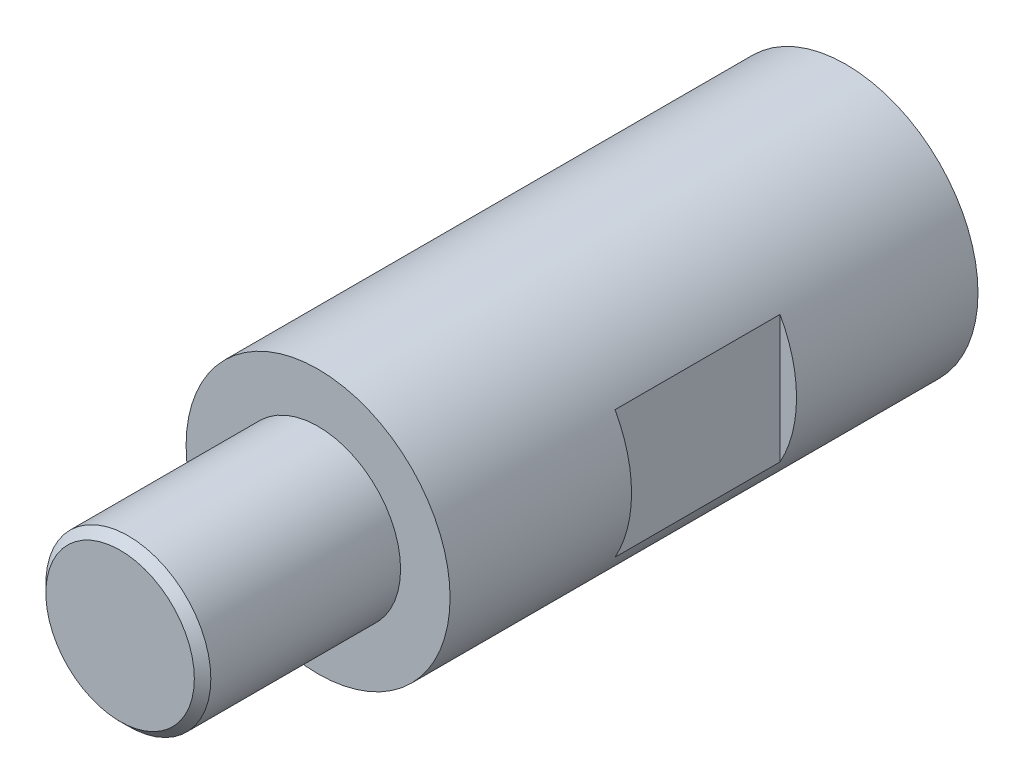
ISO-10303-21;
HEADER;
FILE_DESCRIPTION(('STEP AP214'),'2;1');
FILE_NAME('part.step','',(''),(''),'','','');
FILE_SCHEMA(('AUTOMOTIVE_DESIGN { 1 0 10303 214 1 1 1 1 }'));
ENDSEC;
DATA;
#1=APPLICATION_CONTEXT('core data for automotive mechanical design processes');
#2=APPLICATION_PROTOCOL_DEFINITION('international standard','automotive_design',2000,#1);
#3=PRODUCT_CONTEXT('',#1,'mechanical');
#4=PRODUCT('Part','Part','',(#3));
#5=PRODUCT_RELATED_PRODUCT_CATEGORY('part','',(#4));
#6=PRODUCT_DEFINITION_FORMATION('','',#4);
#7=PRODUCT_DEFINITION_CONTEXT('part definition',#1,'design');
#8=PRODUCT_DEFINITION('design','',#6,#7);
#9=PRODUCT_DEFINITION_SHAPE('','',#8);
#10=(LENGTH_UNIT() NAMED_UNIT(*) SI_UNIT(.MILLI.,.METRE.));
#11=(NAMED_UNIT(*) PLANE_ANGLE_UNIT() SI_UNIT($,.RADIAN.));
#12=(NAMED_UNIT(*) SI_UNIT($,.STERADIAN.) SOLID_ANGLE_UNIT());
#13=UNCERTAINTY_MEASURE_WITH_UNIT(LENGTH_MEASURE(1.E-05),#10,'distance_accuracy_value','');
#14=(GEOMETRIC_REPRESENTATION_CONTEXT(3) GLOBAL_UNCERTAINTY_ASSIGNED_CONTEXT((#13)) GLOBAL_UNIT_ASSIGNED_CONTEXT((#10,
#11,#12)) REPRESENTATION_CONTEXT('',''));
#15=CARTESIAN_POINT('',(0.,0.,0.));
#16=DIRECTION('',(0.,0.,1.));
#17=DIRECTION('',(1.,0.,0.));
#18=AXIS2_PLACEMENT_3D('',#15,#16,#17);
#19=CARTESIAN_POINT('',(0.,0.,32.));
#20=DIRECTION('',(0.,0.,1.));
#21=DIRECTION('',(1.,0.,0.));
#22=AXIS2_PLACEMENT_3D('',#19,#20,#21);
#23=PLANE('',#22);
#24=CARTESIAN_POINT('',(0.,0.,32.));
#25=DIRECTION('',(0.,0.,1.));
#26=DIRECTION('',(1.,0.,0.));
#27=AXIS2_PLACEMENT_3D('',#24,#25,#26);
#28=CIRCLE('',#27,8.);
#29=CARTESIAN_POINT('',(8.,0.,32.));
#30=VERTEX_POINT('',#29);
#31=EDGE_CURVE('E105',#30,#30,#28,.T.);
#32=ORIENTED_EDGE('',*,*,#31,.T.);
#33=EDGE_LOOP('',(#32));
#34=FACE_BOUND('',#33,.T.);
#35=CARTESIAN_POINT('',(0.,0.,32.));
#36=DIRECTION('',(0.,0.,1.));
#37=DIRECTION('',(1.,0.,0.));
#38=AXIS2_PLACEMENT_3D('',#35,#36,#37);
#39=CIRCLE('',#38,5.);
#40=CARTESIAN_POINT('',(5.,0.,32.));
#41=VERTEX_POINT('',#40);
#42=EDGE_CURVE('E175',#41,#41,#39,.T.);
#43=ORIENTED_EDGE('',*,*,#42,.F.);
#44=EDGE_LOOP('',(#43));
#45=FACE_BOUND('',#44,.T.);
#46=ADVANCED_FACE('F37',(#34,#45),#23,.T.);
#47=CARTESIAN_POINT('',(0.,0.,32.));
#48=DIRECTION('',(0.,0.,-1.));
#49=DIRECTION('',(-1.,0.,0.));
#50=AXIS2_PLACEMENT_3D('',#47,#48,#49);
#51=CYLINDRICAL_SURFACE('',#50,8.);
#52=CARTESIAN_POINT('',(0.,0.,21.));
#53=DIRECTION('',(0.,0.,1.));
#54=DIRECTION('',(1.,0.,0.));
#55=AXIS2_PLACEMENT_3D('',#52,#53,#54);
#56=CIRCLE('',#55,8.);
#57=CARTESIAN_POINT('',(7.,-3.87298334620741,21.));
#58=VERTEX_POINT('',#57);
#59=CARTESIAN_POINT('',(7.,3.87298334620741,21.));
#60=VERTEX_POINT('',#59);
#61=EDGE_CURVE('E130',#58,#60,#56,.T.);
#62=ORIENTED_EDGE('',*,*,#61,.T.);
#63=DIRECTION('',(0.,0.,-1.));
#64=VECTOR('',#63,1.);
#65=CARTESIAN_POINT('',(7.,3.87298334620741,32.));
#66=LINE('',#65,#64);
#67=CARTESIAN_POINT('',(7.,3.87298334620742,11.));
#68=VERTEX_POINT('',#67);
#69=EDGE_CURVE('E127',#60,#68,#66,.T.);
#70=ORIENTED_EDGE('',*,*,#69,.T.);
#71=CARTESIAN_POINT('',(0.,0.,11.));
#72=DIRECTION('',(0.,0.,-1.));
#73=DIRECTION('',(-1.,0.,0.));
#74=AXIS2_PLACEMENT_3D('',#71,#72,#73);
#75=CIRCLE('',#74,8.);
#76=CARTESIAN_POINT('',(7.,-3.87298334620742,11.));
#77=VERTEX_POINT('',#76);
#78=EDGE_CURVE('E121',#68,#77,#75,.T.);
#79=ORIENTED_EDGE('',*,*,#78,.T.);
#80=DIRECTION('',(0.,0.,-1.));
#81=VECTOR('',#80,1.);
#82=CARTESIAN_POINT('',(7.,-3.87298334620741,32.));
#83=LINE('',#82,#81);
#84=EDGE_CURVE('E124',#77,#58,#83,.F.);
#85=ORIENTED_EDGE('',*,*,#84,.T.);
#86=EDGE_LOOP('',(#62,#70,#79,#85));
#87=FACE_BOUND('',#86,.T.);
#88=CARTESIAN_POINT('',(0.,0.,11.));
#89=DIRECTION('',(0.,0.,-1.));
#90=DIRECTION('',(-1.,0.,0.));
#91=AXIS2_PLACEMENT_3D('',#88,#89,#90);
#92=CIRCLE('',#91,8.);
#93=CARTESIAN_POINT('',(-7.,-3.87298334620742,11.));
#94=VERTEX_POINT('',#93);
#95=CARTESIAN_POINT('',(-7.,3.87298334620742,11.));
#96=VERTEX_POINT('',#95);
#97=EDGE_CURVE('E119',#94,#96,#92,.T.);
#98=ORIENTED_EDGE('',*,*,#97,.T.);
#99=DIRECTION('',(0.,0.,-1.));
#100=VECTOR('',#99,1.);
#101=CARTESIAN_POINT('',(-7.,3.87298334620742,32.));
#102=LINE('',#101,#100);
#103=CARTESIAN_POINT('',(-7.,3.87298334620742,21.));
#104=VERTEX_POINT('',#103);
#105=EDGE_CURVE('E113',#96,#104,#102,.F.);
#106=ORIENTED_EDGE('',*,*,#105,.T.);
#107=CARTESIAN_POINT('',(0.,0.,21.));
#108=DIRECTION('',(0.,0.,1.));
#109=DIRECTION('',(1.,0.,0.));
#110=AXIS2_PLACEMENT_3D('',#107,#108,#109);
#111=CIRCLE('',#110,8.);
#112=CARTESIAN_POINT('',(-7.,-3.87298334620742,21.));
#113=VERTEX_POINT('',#112);
#114=EDGE_CURVE('E108',#104,#113,#111,.T.);
#115=ORIENTED_EDGE('',*,*,#114,.T.);
#116=DIRECTION('',(0.,0.,-1.));
#117=VECTOR('',#116,1.);
#118=CARTESIAN_POINT('',(-7.,-3.87298334620742,32.));
#119=LINE('',#118,#117);
#120=EDGE_CURVE('E116',#113,#94,#119,.T.);
#121=ORIENTED_EDGE('',*,*,#120,.T.);
#122=EDGE_LOOP('',(#98,#106,#115,#121));
#123=FACE_BOUND('',#122,.T.);
#124=ORIENTED_EDGE('',*,*,#31,.F.);
#125=EDGE_LOOP('',(#124));
#126=FACE_BOUND('',#125,.T.);
#127=CARTESIAN_POINT('',(0.,0.,0.));
#128=DIRECTION('',(0.,0.,1.));
#129=DIRECTION('',(1.,0.,0.));
#130=AXIS2_PLACEMENT_3D('',#127,#128,#129);
#131=CIRCLE('',#130,8.);
#132=CARTESIAN_POINT('',(8.,0.,0.));
#133=VERTEX_POINT('',#132);
#134=EDGE_CURVE('E103',#133,#133,#131,.T.);
#135=ORIENTED_EDGE('',*,*,#134,.T.);
#136=EDGE_LOOP('',(#135));
#137=FACE_BOUND('',#136,.T.);
#138=ADVANCED_FACE('F146',(#87,#123,#126,#137),#51,.T.);
#139=CARTESIAN_POINT('',(0.,0.,0.));
#140=DIRECTION('',(0.,0.,1.));
#141=DIRECTION('',(1.,0.,0.));
#142=AXIS2_PLACEMENT_3D('',#139,#140,#141);
#143=PLANE('',#142);
#144=CARTESIAN_POINT('',(0.,0.,0.));
#145=DIRECTION('',(0.,0.,-1.));
#146=DIRECTION('',(-1.,0.,0.));
#147=AXIS2_PLACEMENT_3D('',#144,#145,#146);
#148=CIRCLE('',#147,4.);
#149=CARTESIAN_POINT('',(-4.,0.,0.));
#150=VERTEX_POINT('',#149);
#151=EDGE_CURVE('E171',#150,#150,#148,.T.);
#152=ORIENTED_EDGE('',*,*,#151,.F.);
#153=EDGE_LOOP('',(#152));
#154=FACE_BOUND('',#153,.T.);
#155=ORIENTED_EDGE('',*,*,#134,.F.);
#156=EDGE_LOOP('',(#155));
#157=FACE_BOUND('',#156,.T.);
#158=ADVANCED_FACE('F152',(#154,#157),#143,.F.);
#159=CARTESIAN_POINT('',(-8.,-9.25,11.));
#160=DIRECTION('',(0.,0.,-1.));
#161=DIRECTION('',(-1.,0.,0.));
#162=AXIS2_PLACEMENT_3D('',#159,#160,#161);
#163=PLANE('',#162);
#164=ORIENTED_EDGE('',*,*,#97,.F.);
#165=DIRECTION('',(0.,1.,0.));
#166=VECTOR('',#165,1.);
#167=CARTESIAN_POINT('',(-7.,-9.25,11.));
#168=LINE('',#167,#166);
#169=EDGE_CURVE('E100',#94,#96,#168,.T.);
#170=ORIENTED_EDGE('',*,*,#169,.T.);
#171=EDGE_LOOP('',(#164,#170));
#172=FACE_BOUND('',#171,.T.);
#173=ADVANCED_FACE('F160',(#172),#163,.F.);
#174=CARTESIAN_POINT('',(-7.,-9.25,11.));
#175=DIRECTION('',(1.,0.,0.));
#176=DIRECTION('',(0.,0.,-1.));
#177=AXIS2_PLACEMENT_3D('',#174,#175,#176);
#178=PLANE('',#177);
#179=DIRECTION('',(0.,1.,0.));
#180=VECTOR('',#179,1.);
#181=CARTESIAN_POINT('',(-7.,-9.25,21.));
#182=LINE('',#181,#180);
#183=EDGE_CURVE('E58',#113,#104,#182,.T.);
#184=ORIENTED_EDGE('',*,*,#183,.T.);
#185=ORIENTED_EDGE('',*,*,#105,.F.);
#186=ORIENTED_EDGE('',*,*,#169,.F.);
#187=ORIENTED_EDGE('',*,*,#120,.F.);
#188=EDGE_LOOP('',(#184,#185,#186,#187));
#189=FACE_BOUND('',#188,.T.);
#190=ADVANCED_FACE('F165',(#189),#178,.F.);
#191=CARTESIAN_POINT('',(-8.,-9.25,21.));
#192=DIRECTION('',(0.,0.,1.));
#193=DIRECTION('',(1.,0.,0.));
#194=AXIS2_PLACEMENT_3D('',#191,#192,#193);
#195=PLANE('',#194);
#196=ORIENTED_EDGE('',*,*,#183,.F.);
#197=ORIENTED_EDGE('',*,*,#114,.F.);
#198=EDGE_LOOP('',(#196,#197));
#199=FACE_BOUND('',#198,.T.);
#200=ADVANCED_FACE('F157',(#199),#195,.F.);
#201=CARTESIAN_POINT('',(8.,-9.25,21.));
#202=DIRECTION('',(0.,0.,1.));
#203=DIRECTION('',(1.,0.,0.));
#204=AXIS2_PLACEMENT_3D('',#201,#202,#203);
#205=PLANE('',#204);
#206=ORIENTED_EDGE('',*,*,#61,.F.);
#207=DIRECTION('',(0.,1.,0.));
#208=VECTOR('',#207,1.);
#209=CARTESIAN_POINT('',(7.,-9.25,21.));
#210=LINE('',#209,#208);
#211=EDGE_CURVE('E91',#58,#60,#210,.T.);
#212=ORIENTED_EDGE('',*,*,#211,.T.);
#213=EDGE_LOOP('',(#206,#212));
#214=FACE_BOUND('',#213,.T.);
#215=ADVANCED_FACE('F230',(#214),#205,.F.);
#216=CARTESIAN_POINT('',(7.,-9.25,11.));
#217=DIRECTION('',(-1.,0.,0.));
#218=DIRECTION('',(0.,0.,1.));
#219=AXIS2_PLACEMENT_3D('',#216,#217,#218);
#220=PLANE('',#219);
#221=ORIENTED_EDGE('',*,*,#211,.F.);
#222=ORIENTED_EDGE('',*,*,#84,.F.);
#223=DIRECTION('',(0.,1.,0.));
#224=VECTOR('',#223,1.);
#225=CARTESIAN_POINT('',(7.,-9.25,11.));
#226=LINE('',#225,#224);
#227=EDGE_CURVE('E51',#77,#68,#226,.T.);
#228=ORIENTED_EDGE('',*,*,#227,.T.);
#229=ORIENTED_EDGE('',*,*,#69,.F.);
#230=EDGE_LOOP('',(#221,#222,#228,#229));
#231=FACE_BOUND('',#230,.T.);
#232=ADVANCED_FACE('F233',(#231),#220,.F.);
#233=CARTESIAN_POINT('',(8.,-9.25,11.));
#234=DIRECTION('',(0.,0.,-1.));
#235=DIRECTION('',(-1.,0.,0.));
#236=AXIS2_PLACEMENT_3D('',#233,#234,#235);
#237=PLANE('',#236);
#238=ORIENTED_EDGE('',*,*,#227,.F.);
#239=ORIENTED_EDGE('',*,*,#78,.F.);
#240=EDGE_LOOP('',(#238,#239));
#241=FACE_BOUND('',#240,.T.);
#242=ADVANCED_FACE('F83',(#241),#237,.F.);
#243=CARTESIAN_POINT('',(0.,0.,19.75));
#244=DIRECTION('',(0.,0.,-1.));
#245=DIRECTION('',(-1.,0.,0.));
#246=AXIS2_PLACEMENT_3D('',#243,#244,#245);
#247=CONICAL_SURFACE('',#246,3.4,1.02974425867665);
#248=CARTESIAN_POINT('',(0.,0.,21.7929261046937));
#249=VERTEX_POINT('',#248);
#250=VERTEX_LOOP('',#249);
#251=FACE_BOUND('',#250,.T.);
#252=CARTESIAN_POINT('',(0.,0.,19.75));
#253=DIRECTION('',(0.,0.,-1.));
#254=DIRECTION('',(-1.,0.,0.));
#255=AXIS2_PLACEMENT_3D('',#252,#253,#254);
#256=CIRCLE('',#255,3.4);
#257=CARTESIAN_POINT('',(-3.4,0.,19.75));
#258=VERTEX_POINT('',#257);
#259=EDGE_CURVE('E87',#258,#258,#256,.T.);
#260=ORIENTED_EDGE('',*,*,#259,.T.);
#261=EDGE_LOOP('',(#260));
#262=FACE_BOUND('',#261,.T.);
#263=ADVANCED_FACE('F79',(#251,#262),#247,.F.);
#264=CARTESIAN_POINT('',(0.,0.,0.));
#265=DIRECTION('',(0.,0.,-1.));
#266=DIRECTION('',(-1.,0.,0.));
#267=AXIS2_PLACEMENT_3D('',#264,#265,#266);
#268=CYLINDRICAL_SURFACE('',#267,3.4);
#269=ORIENTED_EDGE('',*,*,#259,.F.);
#270=EDGE_LOOP('',(#269));
#271=FACE_BOUND('',#270,.T.);
#272=CARTESIAN_POINT('',(0.,0.,16.));
#273=DIRECTION('',(0.,0.,-1.));
#274=DIRECTION('',(-1.,0.,0.));
#275=AXIS2_PLACEMENT_3D('',#272,#273,#274);
#276=CIRCLE('',#275,3.4);
#277=CARTESIAN_POINT('',(-3.4,0.,16.));
#278=VERTEX_POINT('',#277);
#279=EDGE_CURVE('E89',#278,#278,#276,.T.);
#280=ORIENTED_EDGE('',*,*,#279,.T.);
#281=EDGE_LOOP('',(#280));
#282=FACE_BOUND('',#281,.T.);
#283=ADVANCED_FACE('F82',(#271,#282),#268,.F.);
#284=CARTESIAN_POINT('',(3.4,0.,16.));
#285=DIRECTION('',(0.,0.,1.));
#286=DIRECTION('',(1.,0.,0.));
#287=AXIS2_PLACEMENT_3D('',#284,#285,#286);
#288=PLANE('',#287);
#289=ORIENTED_EDGE('',*,*,#279,.F.);
#290=EDGE_LOOP('',(#289));
#291=FACE_BOUND('',#290,.T.);
#292=CARTESIAN_POINT('',(0.,0.,16.));
#293=DIRECTION('',(0.,0.,-1.));
#294=DIRECTION('',(-1.,0.,0.));
#295=AXIS2_PLACEMENT_3D('',#292,#293,#294);
#296=CIRCLE('',#295,4.);
#297=CARTESIAN_POINT('',(-4.,0.,16.));
#298=VERTEX_POINT('',#297);
#299=EDGE_CURVE('E94',#298,#298,#296,.T.);
#300=ORIENTED_EDGE('',*,*,#299,.T.);
#301=EDGE_LOOP('',(#300));
#302=FACE_BOUND('',#301,.T.);
#303=ADVANCED_FACE('F223',(#291,#302),#288,.F.);
#304=CARTESIAN_POINT('',(0.,0.,0.));
#305=DIRECTION('',(0.,0.,-1.));
#306=DIRECTION('',(-1.,0.,0.));
#307=AXIS2_PLACEMENT_3D('',#304,#305,#306);
#308=CYLINDRICAL_SURFACE('',#307,4.);
#309=ORIENTED_EDGE('',*,*,#299,.F.);
#310=EDGE_LOOP('',(#309));
#311=FACE_BOUND('',#310,.T.);
#312=ORIENTED_EDGE('',*,*,#151,.T.);
#313=EDGE_LOOP('',(#312));
#314=FACE_BOUND('',#313,.T.);
#315=ADVANCED_FACE('F219',(#311,#314),#308,.F.);
#316=CARTESIAN_POINT('',(0.,0.,44.));
#317=DIRECTION('',(0.,0.,-1.));
#318=DIRECTION('',(-1.,0.,0.));
#319=AXIS2_PLACEMENT_3D('',#316,#317,#318);
#320=CYLINDRICAL_SURFACE('',#319,5.);
#321=CARTESIAN_POINT('',(0.,0.,43.5));
#322=DIRECTION('',(0.,0.,1.));
#323=DIRECTION('',(1.,0.,0.));
#324=AXIS2_PLACEMENT_3D('',#321,#322,#323);
#325=CIRCLE('',#324,5.);
#326=CARTESIAN_POINT('',(5.,0.,43.5));
#327=VERTEX_POINT('',#326);
#328=EDGE_CURVE('E11',#327,#327,#325,.F.);
#329=ORIENTED_EDGE('',*,*,#328,.T.);
#330=EDGE_LOOP('',(#329));
#331=FACE_BOUND('',#330,.T.);
#332=ORIENTED_EDGE('',*,*,#42,.T.);
#333=EDGE_LOOP('',(#332));
#334=FACE_BOUND('',#333,.T.);
#335=ADVANCED_FACE('F142',(#331,#334),#320,.T.);
#336=CARTESIAN_POINT('',(0.,0.,44.));
#337=DIRECTION('',(0.,0.,1.));
#338=DIRECTION('',(1.,0.,0.));
#339=AXIS2_PLACEMENT_3D('',#336,#337,#338);
#340=PLANE('',#339);
#341=CARTESIAN_POINT('',(0.,0.,44.));
#342=DIRECTION('',(0.,0.,1.));
#343=DIRECTION('',(1.,0.,0.));
#344=AXIS2_PLACEMENT_3D('',#341,#342,#343);
#345=CIRCLE('',#344,4.49999999999999);
#346=CARTESIAN_POINT('',(4.49999999999999,0.,44.));
#347=VERTEX_POINT('',#346);
#348=EDGE_CURVE('E45',#347,#347,#345,.T.);
#349=ORIENTED_EDGE('',*,*,#348,.T.);
#350=EDGE_LOOP('',(#349));
#351=FACE_BOUND('',#350,.T.);
#352=ADVANCED_FACE('F134',(#351),#340,.T.);
#353=CARTESIAN_POINT('',(0.,0.,44.));
#354=DIRECTION('',(0.,0.,-1.));
#355=DIRECTION('',(-1.,0.,0.));
#356=AXIS2_PLACEMENT_3D('',#353,#354,#355);
#357=CONICAL_SURFACE('',#356,4.49999999999999,0.785398163397444);
#358=ORIENTED_EDGE('',*,*,#328,.F.);
#359=EDGE_LOOP('',(#358));
#360=FACE_BOUND('',#359,.T.);
#361=ORIENTED_EDGE('',*,*,#348,.F.);
#362=EDGE_LOOP('',(#361));
#363=FACE_BOUND('',#362,.T.);
#364=ADVANCED_FACE('F39',(#360,#363),#357,.T.);
#365=CLOSED_SHELL('',(#46,#138,#158,#173,#190,#200,#215,#232,#242,#263,#283,#303,#315,#335,#352,#364));
#366=CARTESIAN_POINT('',(0.,4.5,32.));
#367=DIRECTION('',(0.,0.,1.));
#368=DIRECTION('',(1.,0.,0.));
#369=AXIS2_PLACEMENT_3D('',#366,#367,#368);
#370=PLANE('',#369);
#371=CARTESIAN_POINT('',(0.,0.,32.));
#372=DIRECTION('',(0.,0.,1.));
#373=DIRECTION('',(1.,0.,0.));
#374=AXIS2_PLACEMENT_3D('',#371,#372,#373);
#375=CIRCLE('',#374,4.5);
#376=CARTESIAN_POINT('',(4.5,0.,32.));
#377=VERTEX_POINT('',#376);
#378=EDGE_CURVE('E190',#377,#377,#375,.T.);
#379=ORIENTED_EDGE('',*,*,#378,.T.);
#380=EDGE_LOOP('',(#379));
#381=FACE_BOUND('',#380,.T.);
#382=CARTESIAN_POINT('',(0.,0.,32.));
#383=DIRECTION('',(0.,0.,1.));
#384=DIRECTION('',(1.,0.,0.));
#385=AXIS2_PLACEMENT_3D('',#382,#383,#384);
#386=CIRCLE('',#385,4.4300143575989);
#387=CARTESIAN_POINT('',(4.4300143575989,0.,32.));
#388=VERTEX_POINT('',#387);
#389=EDGE_CURVE('E179',#388,#388,#386,.T.);
#390=ORIENTED_EDGE('',*,*,#389,.F.);
#391=EDGE_LOOP('',(#390));
#392=FACE_BOUND('',#391,.T.);
#393=ADVANCED_FACE('F194',(#381,#392),#370,.T.);
#394=CARTESIAN_POINT('',(0.,0.,21.));
#395=DIRECTION('',(0.,0.,1.));
#396=DIRECTION('',(1.,0.,0.));
#397=AXIS2_PLACEMENT_3D('',#394,#395,#396);
#398=CYLINDRICAL_SURFACE('',#397,4.4300143575989);
#399=ORIENTED_EDGE('',*,*,#389,.T.);
#400=EDGE_LOOP('',(#399));
#401=FACE_BOUND('',#400,.T.);
#402=CARTESIAN_POINT('',(0.,0.,33.5));
#403=DIRECTION('',(0.,0.,1.));
#404=DIRECTION('',(1.,0.,0.));
#405=AXIS2_PLACEMENT_3D('',#402,#403,#404);
#406=CIRCLE('',#405,4.4300143575989);
#407=CARTESIAN_POINT('',(4.4300143575989,0.,33.5));
#408=VERTEX_POINT('',#407);
#409=EDGE_CURVE('E184',#408,#408,#406,.T.);
#410=ORIENTED_EDGE('',*,*,#409,.F.);
#411=EDGE_LOOP('',(#410));
#412=FACE_BOUND('',#411,.T.);
#413=ADVANCED_FACE('F206',(#401,#412),#398,.T.);
#414=CARTESIAN_POINT('',(0.,4.5,33.5));
#415=DIRECTION('',(0.,0.,-1.));
#416=DIRECTION('',(-1.,0.,0.));
#417=AXIS2_PLACEMENT_3D('',#414,#415,#416);
#418=PLANE('',#417);
#419=ORIENTED_EDGE('',*,*,#409,.T.);
#420=EDGE_LOOP('',(#419));
#421=FACE_BOUND('',#420,.T.);
#422=CARTESIAN_POINT('',(0.,0.,33.5));
#423=DIRECTION('',(0.,0.,1.));
#424=DIRECTION('',(1.,0.,0.));
#425=AXIS2_PLACEMENT_3D('',#422,#423,#424);
#426=CIRCLE('',#425,4.5);
#427=CARTESIAN_POINT('',(4.5,0.,33.5));
#428=VERTEX_POINT('',#427);
#429=EDGE_CURVE('E187',#428,#428,#426,.T.);
#430=ORIENTED_EDGE('',*,*,#429,.F.);
#431=EDGE_LOOP('',(#430));
#432=FACE_BOUND('',#431,.T.);
#433=ADVANCED_FACE('F199',(#421,#432),#418,.T.);
#434=CARTESIAN_POINT('',(0.,0.,21.));
#435=DIRECTION('',(0.,0.,1.));
#436=DIRECTION('',(1.,0.,0.));
#437=AXIS2_PLACEMENT_3D('',#434,#435,#436);
#438=CYLINDRICAL_SURFACE('',#437,4.5);
#439=ORIENTED_EDGE('',*,*,#429,.T.);
#440=EDGE_LOOP('',(#439));
#441=FACE_BOUND('',#440,.T.);
#442=ORIENTED_EDGE('',*,*,#378,.F.);
#443=EDGE_LOOP('',(#442));
#444=FACE_BOUND('',#443,.T.);
#445=ADVANCED_FACE('F197',(#441,#444),#438,.F.);
#446=CLOSED_SHELL('',(#393,#413,#433,#445));
#447=ORIENTED_CLOSED_SHELL('',*,#446,.T.);
#448=BREP_WITH_VOIDS('B2',#365,(#447));
#449=ADVANCED_BREP_SHAPE_REPRESENTATION('',(#18,#448),#14);
#450=SHAPE_DEFINITION_REPRESENTATION(#9,#449);
ENDSEC;
END-ISO-10303-21;
